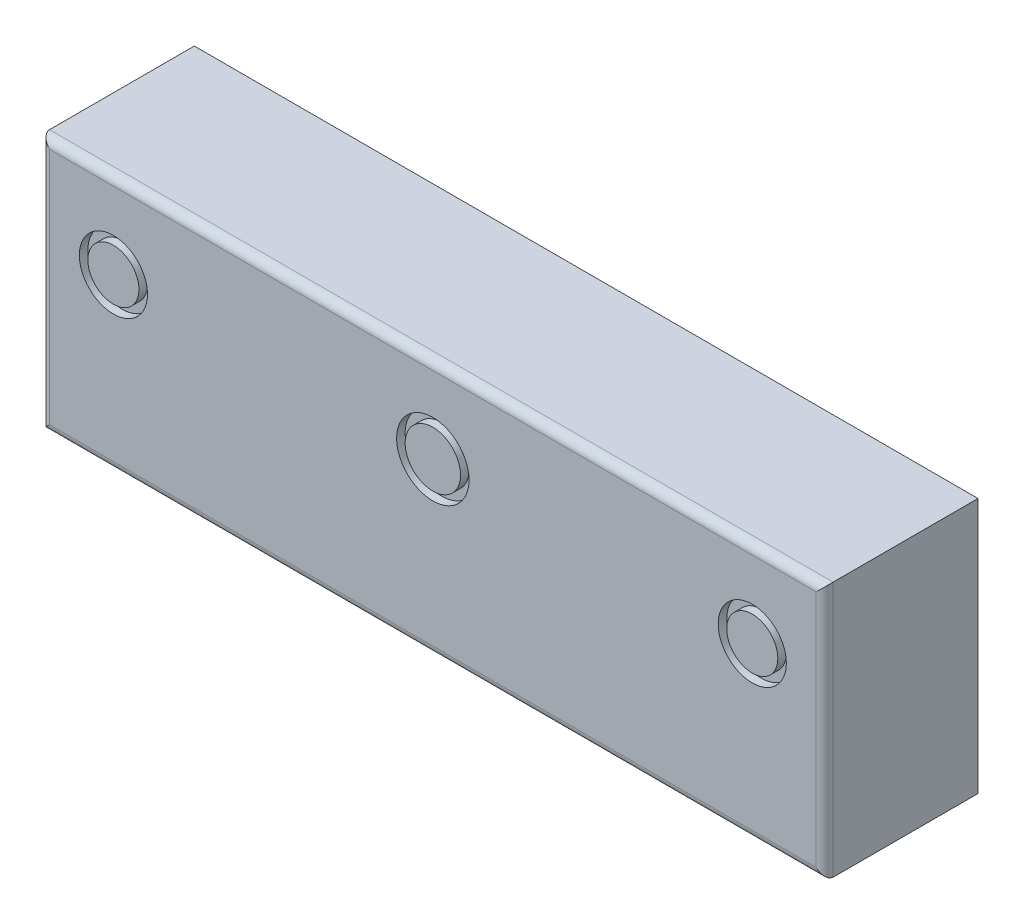
ISO-10303-21;
HEADER;
FILE_DESCRIPTION(('STEP AP214'),'2;1');
FILE_NAME('part.step','',(''),(''),'','','');
FILE_SCHEMA(('AUTOMOTIVE_DESIGN { 1 0 10303 214 1 1 1 1 }'));
ENDSEC;
DATA;
#1=APPLICATION_CONTEXT('core data for automotive mechanical design processes');
#2=APPLICATION_PROTOCOL_DEFINITION('international standard','automotive_design',2000,#1);
#3=PRODUCT_CONTEXT('',#1,'mechanical');
#4=PRODUCT('Part','Part','',(#3));
#5=PRODUCT_RELATED_PRODUCT_CATEGORY('part','',(#4));
#6=PRODUCT_DEFINITION_FORMATION('','',#4);
#7=PRODUCT_DEFINITION_CONTEXT('part definition',#1,'design');
#8=PRODUCT_DEFINITION('design','',#6,#7);
#9=PRODUCT_DEFINITION_SHAPE('','',#8);
#10=(LENGTH_UNIT() NAMED_UNIT(*) SI_UNIT(.MILLI.,.METRE.));
#11=(NAMED_UNIT(*) PLANE_ANGLE_UNIT() SI_UNIT($,.RADIAN.));
#12=(NAMED_UNIT(*) SI_UNIT($,.STERADIAN.) SOLID_ANGLE_UNIT());
#13=UNCERTAINTY_MEASURE_WITH_UNIT(LENGTH_MEASURE(1.E-05),#10,'distance_accuracy_value','');
#14=(GEOMETRIC_REPRESENTATION_CONTEXT(3) GLOBAL_UNCERTAINTY_ASSIGNED_CONTEXT((#13)) GLOBAL_UNIT_ASSIGNED_CONTEXT((#10,
#11,#12)) REPRESENTATION_CONTEXT('',''));
#15=CARTESIAN_POINT('',(0.,0.,0.));
#16=DIRECTION('',(0.,0.,1.));
#17=DIRECTION('',(1.,0.,0.));
#18=AXIS2_PLACEMENT_3D('',#15,#16,#17);
#19=CARTESIAN_POINT('',(45.9999999999999,-15.,18.));
#20=DIRECTION('',(-1.,0.,0.));
#21=DIRECTION('',(0.,0.,1.));
#22=AXIS2_PLACEMENT_3D('',#19,#20,#21);
#23=PLANE('',#22);
#24=DIRECTION('',(0.,0.,-1.));
#25=VECTOR('',#24,1.);
#26=CARTESIAN_POINT('',(45.9999999999999,15.,18.));
#27=LINE('',#26,#25);
#28=CARTESIAN_POINT('',(45.9999999999999,15.,17.));
#29=VERTEX_POINT('',#28);
#30=CARTESIAN_POINT('',(45.9999999999999,15.,0.));
#31=VERTEX_POINT('',#30);
#32=EDGE_CURVE('E98',#29,#31,#27,.T.);
#33=ORIENTED_EDGE('',*,*,#32,.F.);
#34=DIRECTION('',(0.,1.,0.));
#35=VECTOR('',#34,1.);
#36=CARTESIAN_POINT('',(45.9999999999999,-15.,17.));
#37=LINE('',#36,#35);
#38=CARTESIAN_POINT('',(45.9999999999999,-15.,17.));
#39=VERTEX_POINT('',#38);
#40=EDGE_CURVE('E56',#29,#39,#37,.F.);
#41=ORIENTED_EDGE('',*,*,#40,.T.);
#42=DIRECTION('',(0.,0.,-1.));
#43=VECTOR('',#42,1.);
#44=CARTESIAN_POINT('',(45.9999999999999,-15.,18.));
#45=LINE('',#44,#43);
#46=CARTESIAN_POINT('',(45.9999999999999,-15.,0.));
#47=VERTEX_POINT('',#46);
#48=EDGE_CURVE('E115',#39,#47,#45,.T.);
#49=ORIENTED_EDGE('',*,*,#48,.T.);
#50=DIRECTION('',(0.,1.,0.));
#51=VECTOR('',#50,1.);
#52=CARTESIAN_POINT('',(45.9999999999999,-15.,0.));
#53=LINE('',#52,#51);
#54=EDGE_CURVE('E111',#47,#31,#53,.T.);
#55=ORIENTED_EDGE('',*,*,#54,.T.);
#56=EDGE_LOOP('',(#33,#41,#49,#55));
#57=FACE_BOUND('',#56,.T.);
#58=ADVANCED_FACE('F47',(#57),#23,.F.);
#59=CARTESIAN_POINT('',(-46.0000000000001,15.,18.));
#60=DIRECTION('',(0.,-1.,0.));
#61=DIRECTION('',(0.,0.,-1.));
#62=AXIS2_PLACEMENT_3D('',#59,#60,#61);
#63=PLANE('',#62);
#64=DIRECTION('',(0.,0.,-1.));
#65=VECTOR('',#64,1.);
#66=CARTESIAN_POINT('',(-46.0000000000001,15.,18.));
#67=LINE('',#66,#65);
#68=CARTESIAN_POINT('',(-46.0000000000001,15.,17.));
#69=VERTEX_POINT('',#68);
#70=CARTESIAN_POINT('',(-46.0000000000001,15.,0.));
#71=VERTEX_POINT('',#70);
#72=EDGE_CURVE('E105',#69,#71,#67,.T.);
#73=ORIENTED_EDGE('',*,*,#72,.F.);
#74=DIRECTION('',(-1.,0.,0.));
#75=VECTOR('',#74,1.);
#76=CARTESIAN_POINT('',(-46.0000000000001,15.,17.));
#77=LINE('',#76,#75);
#78=EDGE_CURVE('E11',#69,#29,#77,.F.);
#79=ORIENTED_EDGE('',*,*,#78,.T.);
#80=ORIENTED_EDGE('',*,*,#32,.T.);
#81=DIRECTION('',(-1.,0.,0.));
#82=VECTOR('',#81,1.);
#83=CARTESIAN_POINT('',(-46.0000000000001,15.,0.));
#84=LINE('',#83,#82);
#85=EDGE_CURVE('E101',#31,#71,#84,.T.);
#86=ORIENTED_EDGE('',*,*,#85,.T.);
#87=EDGE_LOOP('',(#73,#79,#80,#86));
#88=FACE_BOUND('',#87,.T.);
#89=ADVANCED_FACE('F100',(#88),#63,.F.);
#90=CARTESIAN_POINT('',(-46.0000000000001,-15.,18.));
#91=DIRECTION('',(1.,0.,0.));
#92=DIRECTION('',(0.,0.,-1.));
#93=AXIS2_PLACEMENT_3D('',#90,#91,#92);
#94=PLANE('',#93);
#95=DIRECTION('',(0.,0.,-1.));
#96=VECTOR('',#95,1.);
#97=CARTESIAN_POINT('',(-46.0000000000001,-15.,18.));
#98=LINE('',#97,#96);
#99=CARTESIAN_POINT('',(-46.0000000000001,-15.,17.));
#100=VERTEX_POINT('',#99);
#101=CARTESIAN_POINT('',(-46.0000000000001,-15.,0.));
#102=VERTEX_POINT('',#101);
#103=EDGE_CURVE('E130',#100,#102,#98,.T.);
#104=ORIENTED_EDGE('',*,*,#103,.F.);
#105=DIRECTION('',(0.,-1.,0.));
#106=VECTOR('',#105,1.);
#107=CARTESIAN_POINT('',(-46.0000000000001,-15.,17.));
#108=LINE('',#107,#106);
#109=EDGE_CURVE('E141',#100,#69,#108,.F.);
#110=ORIENTED_EDGE('',*,*,#109,.T.);
#111=ORIENTED_EDGE('',*,*,#72,.T.);
#112=DIRECTION('',(0.,-1.,0.));
#113=VECTOR('',#112,1.);
#114=CARTESIAN_POINT('',(-46.0000000000001,-15.,0.));
#115=LINE('',#114,#113);
#116=EDGE_CURVE('E113',#71,#102,#115,.T.);
#117=ORIENTED_EDGE('',*,*,#116,.T.);
#118=EDGE_LOOP('',(#104,#110,#111,#117));
#119=FACE_BOUND('',#118,.T.);
#120=ADVANCED_FACE('F200',(#119),#94,.F.);
#121=CARTESIAN_POINT('',(-46.0000000000001,-15.,18.));
#122=DIRECTION('',(0.,1.,0.));
#123=DIRECTION('',(0.,0.,1.));
#124=AXIS2_PLACEMENT_3D('',#121,#122,#123);
#125=PLANE('',#124);
#126=ORIENTED_EDGE('',*,*,#48,.F.);
#127=DIRECTION('',(1.,0.,0.));
#128=VECTOR('',#127,1.);
#129=CARTESIAN_POINT('',(-46.0000000000001,-15.,17.));
#130=LINE('',#129,#128);
#131=EDGE_CURVE('E144',#39,#100,#130,.F.);
#132=ORIENTED_EDGE('',*,*,#131,.T.);
#133=ORIENTED_EDGE('',*,*,#103,.T.);
#134=DIRECTION('',(1.,0.,0.));
#135=VECTOR('',#134,1.);
#136=CARTESIAN_POINT('',(-46.0000000000001,-15.,0.));
#137=LINE('',#136,#135);
#138=EDGE_CURVE('E127',#102,#47,#137,.T.);
#139=ORIENTED_EDGE('',*,*,#138,.T.);
#140=EDGE_LOOP('',(#126,#132,#133,#139));
#141=FACE_BOUND('',#140,.T.);
#142=ADVANCED_FACE('F229',(#141),#125,.F.);
#143=CARTESIAN_POINT('',(0.,0.,18.));
#144=DIRECTION('',(0.,0.,-1.));
#145=DIRECTION('',(-1.,0.,0.));
#146=AXIS2_PLACEMENT_3D('',#143,#144,#145);
#147=PLANE('',#146);
#148=DIRECTION('',(-1.,0.,0.));
#149=VECTOR('',#148,1.);
#150=CARTESIAN_POINT('',(0.,14.,18.));
#151=LINE('',#150,#149);
#152=CARTESIAN_POINT('',(44.9999999999999,14.,18.));
#153=VERTEX_POINT('',#152);
#154=CARTESIAN_POINT('',(-45.0000000000001,14.,18.));
#155=VERTEX_POINT('',#154);
#156=EDGE_CURVE('E104',#153,#155,#151,.T.);
#157=ORIENTED_EDGE('',*,*,#156,.T.);
#158=DIRECTION('',(0.,-1.,0.));
#159=VECTOR('',#158,1.);
#160=CARTESIAN_POINT('',(-45.0000000000001,0.,18.));
#161=LINE('',#160,#159);
#162=CARTESIAN_POINT('',(-45.0000000000001,-14.,18.));
#163=VERTEX_POINT('',#162);
#164=EDGE_CURVE('E138',#155,#163,#161,.T.);
#165=ORIENTED_EDGE('',*,*,#164,.T.);
#166=DIRECTION('',(1.,0.,0.));
#167=VECTOR('',#166,1.);
#168=CARTESIAN_POINT('',(0.,-14.,18.));
#169=LINE('',#168,#167);
#170=CARTESIAN_POINT('',(44.9999999999999,-14.,18.));
#171=VERTEX_POINT('',#170);
#172=EDGE_CURVE('E136',#163,#171,#169,.T.);
#173=ORIENTED_EDGE('',*,*,#172,.T.);
#174=DIRECTION('',(0.,1.,0.));
#175=VECTOR('',#174,1.);
#176=CARTESIAN_POINT('',(44.9999999999999,0.,18.));
#177=LINE('',#176,#175);
#178=EDGE_CURVE('E134',#171,#153,#177,.T.);
#179=ORIENTED_EDGE('',*,*,#178,.T.);
#180=EDGE_LOOP('',(#157,#165,#173,#179));
#181=FACE_BOUND('',#180,.T.);
#182=CARTESIAN_POINT('',(-37.5,5.,18.));
#183=DIRECTION('',(0.,0.,1.));
#184=DIRECTION('',(1.,0.,0.));
#185=AXIS2_PLACEMENT_3D('',#182,#183,#184);
#186=CIRCLE('',#185,4.);
#187=CARTESIAN_POINT('',(-33.5,5.,18.));
#188=VERTEX_POINT('',#187);
#189=EDGE_CURVE('E120',#188,#188,#186,.T.);
#190=ORIENTED_EDGE('',*,*,#189,.F.);
#191=EDGE_LOOP('',(#190));
#192=FACE_BOUND('',#191,.T.);
#193=CARTESIAN_POINT('',(0.,5.,18.));
#194=DIRECTION('',(0.,0.,1.));
#195=DIRECTION('',(1.,0.,0.));
#196=AXIS2_PLACEMENT_3D('',#193,#194,#195);
#197=CIRCLE('',#196,4.25);
#198=CARTESIAN_POINT('',(4.25,5.,18.));
#199=VERTEX_POINT('',#198);
#200=EDGE_CURVE('E175',#199,#199,#197,.T.);
#201=ORIENTED_EDGE('',*,*,#200,.F.);
#202=EDGE_LOOP('',(#201));
#203=FACE_BOUND('',#202,.T.);
#204=CARTESIAN_POINT('',(37.5,5.00000000000001,18.));
#205=DIRECTION('',(0.,0.,1.));
#206=DIRECTION('',(1.,0.,0.));
#207=AXIS2_PLACEMENT_3D('',#204,#205,#206);
#208=CIRCLE('',#207,4.);
#209=CARTESIAN_POINT('',(41.5,5.00000000000001,18.));
#210=VERTEX_POINT('',#209);
#211=EDGE_CURVE('E162',#210,#210,#208,.T.);
#212=ORIENTED_EDGE('',*,*,#211,.F.);
#213=EDGE_LOOP('',(#212));
#214=FACE_BOUND('',#213,.T.);
#215=ADVANCED_FACE('F224',(#181,#192,#203,#214),#147,.F.);
#216=CARTESIAN_POINT('',(0.,0.,0.));
#217=DIRECTION('',(0.,0.,-1.));
#218=DIRECTION('',(-1.,0.,0.));
#219=AXIS2_PLACEMENT_3D('',#216,#217,#218);
#220=PLANE('',#219);
#221=ORIENTED_EDGE('',*,*,#54,.F.);
#222=ORIENTED_EDGE('',*,*,#138,.F.);
#223=ORIENTED_EDGE('',*,*,#116,.F.);
#224=ORIENTED_EDGE('',*,*,#85,.F.);
#225=EDGE_LOOP('',(#221,#222,#223,#224));
#226=FACE_BOUND('',#225,.T.);
#227=ADVANCED_FACE('F109',(#226),#220,.T.);
#228=CARTESIAN_POINT('',(37.5,5.00000000000001,17.));
#229=DIRECTION('',(0.,0.,1.));
#230=DIRECTION('',(1.,0.,0.));
#231=AXIS2_PLACEMENT_3D('',#228,#229,#230);
#232=CYLINDRICAL_SURFACE('',#231,4.);
#233=CARTESIAN_POINT('',(37.5,5.00000000000001,17.));
#234=DIRECTION('',(0.,0.,1.));
#235=DIRECTION('',(1.,0.,0.));
#236=AXIS2_PLACEMENT_3D('',#233,#234,#235);
#237=CIRCLE('',#236,4.);
#238=CARTESIAN_POINT('',(41.5,5.00000000000001,17.));
#239=VERTEX_POINT('',#238);
#240=EDGE_CURVE('E157',#239,#239,#237,.T.);
#241=ORIENTED_EDGE('',*,*,#240,.F.);
#242=EDGE_LOOP('',(#241));
#243=FACE_BOUND('',#242,.T.);
#244=ORIENTED_EDGE('',*,*,#211,.T.);
#245=EDGE_LOOP('',(#244));
#246=FACE_BOUND('',#245,.T.);
#247=ADVANCED_FACE('F185',(#243,#246),#232,.F.);
#248=CARTESIAN_POINT('',(37.5,5.00000000000001,17.));
#249=DIRECTION('',(0.,0.,1.));
#250=DIRECTION('',(1.,0.,0.));
#251=AXIS2_PLACEMENT_3D('',#248,#249,#250);
#252=PLANE('',#251);
#253=CARTESIAN_POINT('',(37.5,5.00000000000001,17.));
#254=DIRECTION('',(0.,0.,1.));
#255=DIRECTION('',(1.,0.,0.));
#256=AXIS2_PLACEMENT_3D('',#253,#254,#255);
#257=CIRCLE('',#256,3.);
#258=CARTESIAN_POINT('',(40.5,5.00000000000001,17.));
#259=VERTEX_POINT('',#258);
#260=EDGE_CURVE('E123',#259,#259,#257,.T.);
#261=ORIENTED_EDGE('',*,*,#260,.F.);
#262=EDGE_LOOP('',(#261));
#263=FACE_BOUND('',#262,.T.);
#264=ORIENTED_EDGE('',*,*,#240,.T.);
#265=EDGE_LOOP('',(#264));
#266=FACE_BOUND('',#265,.T.);
#267=ADVANCED_FACE('F183',(#263,#266),#252,.T.);
#268=CARTESIAN_POINT('',(37.5,5.00000000000001,17.));
#269=DIRECTION('',(0.,0.,1.));
#270=DIRECTION('',(1.,0.,0.));
#271=AXIS2_PLACEMENT_3D('',#268,#269,#270);
#272=CYLINDRICAL_SURFACE('',#271,3.);
#273=ORIENTED_EDGE('',*,*,#260,.T.);
#274=EDGE_LOOP('',(#273));
#275=FACE_BOUND('',#274,.T.);
#276=CARTESIAN_POINT('',(37.5,5.00000000000001,18.));
#277=DIRECTION('',(0.,0.,1.));
#278=DIRECTION('',(1.,0.,0.));
#279=AXIS2_PLACEMENT_3D('',#276,#277,#278);
#280=CIRCLE('',#279,3.);
#281=CARTESIAN_POINT('',(40.5,5.00000000000001,18.));
#282=VERTEX_POINT('',#281);
#283=EDGE_CURVE('E169',#282,#282,#280,.T.);
#284=ORIENTED_EDGE('',*,*,#283,.F.);
#285=EDGE_LOOP('',(#284));
#286=FACE_BOUND('',#285,.T.);
#287=ADVANCED_FACE('F180',(#275,#286),#272,.T.);
#288=CARTESIAN_POINT('',(0.,5.,17.));
#289=DIRECTION('',(0.,0.,1.));
#290=DIRECTION('',(1.,0.,0.));
#291=AXIS2_PLACEMENT_3D('',#288,#289,#290);
#292=CYLINDRICAL_SURFACE('',#291,4.25);
#293=CARTESIAN_POINT('',(0.,5.,17.));
#294=DIRECTION('',(0.,0.,1.));
#295=DIRECTION('',(1.,0.,0.));
#296=AXIS2_PLACEMENT_3D('',#293,#294,#295);
#297=CIRCLE('',#296,4.25);
#298=CARTESIAN_POINT('',(4.25,5.,17.));
#299=VERTEX_POINT('',#298);
#300=EDGE_CURVE('E171',#299,#299,#297,.T.);
#301=ORIENTED_EDGE('',*,*,#300,.F.);
#302=EDGE_LOOP('',(#301));
#303=FACE_BOUND('',#302,.T.);
#304=ORIENTED_EDGE('',*,*,#200,.T.);
#305=EDGE_LOOP('',(#304));
#306=FACE_BOUND('',#305,.T.);
#307=ADVANCED_FACE('F191',(#303,#306),#292,.F.);
#308=CARTESIAN_POINT('',(0.,5.,17.));
#309=DIRECTION('',(0.,0.,1.));
#310=DIRECTION('',(1.,0.,0.));
#311=AXIS2_PLACEMENT_3D('',#308,#309,#310);
#312=PLANE('',#311);
#313=CARTESIAN_POINT('',(0.,5.,17.));
#314=DIRECTION('',(0.,0.,1.));
#315=DIRECTION('',(1.,0.,0.));
#316=AXIS2_PLACEMENT_3D('',#313,#314,#315);
#317=CIRCLE('',#316,3.25);
#318=CARTESIAN_POINT('',(3.25,5.,17.));
#319=VERTEX_POINT('',#318);
#320=EDGE_CURVE('E247',#319,#319,#317,.T.);
#321=ORIENTED_EDGE('',*,*,#320,.F.);
#322=EDGE_LOOP('',(#321));
#323=FACE_BOUND('',#322,.T.);
#324=ORIENTED_EDGE('',*,*,#300,.T.);
#325=EDGE_LOOP('',(#324));
#326=FACE_BOUND('',#325,.T.);
#327=ADVANCED_FACE('F279',(#323,#326),#312,.T.);
#328=CARTESIAN_POINT('',(0.,5.,17.));
#329=DIRECTION('',(0.,0.,1.));
#330=DIRECTION('',(1.,0.,0.));
#331=AXIS2_PLACEMENT_3D('',#328,#329,#330);
#332=CYLINDRICAL_SURFACE('',#331,3.25);
#333=ORIENTED_EDGE('',*,*,#320,.T.);
#334=EDGE_LOOP('',(#333));
#335=FACE_BOUND('',#334,.T.);
#336=CARTESIAN_POINT('',(0.,5.,18.));
#337=DIRECTION('',(0.,0.,1.));
#338=DIRECTION('',(1.,0.,0.));
#339=AXIS2_PLACEMENT_3D('',#336,#337,#338);
#340=CIRCLE('',#339,3.25);
#341=CARTESIAN_POINT('',(3.25,5.,18.));
#342=VERTEX_POINT('',#341);
#343=EDGE_CURVE('E250',#342,#342,#340,.T.);
#344=ORIENTED_EDGE('',*,*,#343,.F.);
#345=EDGE_LOOP('',(#344));
#346=FACE_BOUND('',#345,.T.);
#347=ADVANCED_FACE('F269',(#335,#346),#332,.T.);
#348=CARTESIAN_POINT('',(-37.5,5.,17.));
#349=DIRECTION('',(0.,0.,1.));
#350=DIRECTION('',(1.,0.,0.));
#351=AXIS2_PLACEMENT_3D('',#348,#349,#350);
#352=CYLINDRICAL_SURFACE('',#351,4.);
#353=CARTESIAN_POINT('',(-37.5,5.,17.));
#354=DIRECTION('',(0.,0.,1.));
#355=DIRECTION('',(1.,0.,0.));
#356=AXIS2_PLACEMENT_3D('',#353,#354,#355);
#357=CIRCLE('',#356,4.);
#358=CARTESIAN_POINT('',(-33.5,5.,17.));
#359=VERTEX_POINT('',#358);
#360=EDGE_CURVE('E117',#359,#359,#357,.T.);
#361=ORIENTED_EDGE('',*,*,#360,.F.);
#362=EDGE_LOOP('',(#361));
#363=FACE_BOUND('',#362,.T.);
#364=ORIENTED_EDGE('',*,*,#189,.T.);
#365=EDGE_LOOP('',(#364));
#366=FACE_BOUND('',#365,.T.);
#367=ADVANCED_FACE('F266',(#363,#366),#352,.F.);
#368=CARTESIAN_POINT('',(-37.5,5.,17.));
#369=DIRECTION('',(0.,0.,1.));
#370=DIRECTION('',(1.,0.,0.));
#371=AXIS2_PLACEMENT_3D('',#368,#369,#370);
#372=PLANE('',#371);
#373=CARTESIAN_POINT('',(-37.5,5.,17.));
#374=DIRECTION('',(0.,0.,1.));
#375=DIRECTION('',(1.,0.,0.));
#376=AXIS2_PLACEMENT_3D('',#373,#374,#375);
#377=CIRCLE('',#376,3.);
#378=CARTESIAN_POINT('',(-34.5,5.,17.));
#379=VERTEX_POINT('',#378);
#380=EDGE_CURVE('E258',#379,#379,#377,.T.);
#381=ORIENTED_EDGE('',*,*,#380,.F.);
#382=EDGE_LOOP('',(#381));
#383=FACE_BOUND('',#382,.T.);
#384=ORIENTED_EDGE('',*,*,#360,.T.);
#385=EDGE_LOOP('',(#384));
#386=FACE_BOUND('',#385,.T.);
#387=ADVANCED_FACE('F268',(#383,#386),#372,.T.);
#388=CARTESIAN_POINT('',(-37.5,5.,17.));
#389=DIRECTION('',(0.,0.,1.));
#390=DIRECTION('',(1.,0.,0.));
#391=AXIS2_PLACEMENT_3D('',#388,#389,#390);
#392=CYLINDRICAL_SURFACE('',#391,3.);
#393=ORIENTED_EDGE('',*,*,#380,.T.);
#394=EDGE_LOOP('',(#393));
#395=FACE_BOUND('',#394,.T.);
#396=CARTESIAN_POINT('',(-37.5,5.,18.));
#397=DIRECTION('',(0.,0.,1.));
#398=DIRECTION('',(1.,0.,0.));
#399=AXIS2_PLACEMENT_3D('',#396,#397,#398);
#400=CIRCLE('',#399,3.);
#401=CARTESIAN_POINT('',(-34.5,5.,18.));
#402=VERTEX_POINT('',#401);
#403=EDGE_CURVE('E254',#402,#402,#400,.T.);
#404=ORIENTED_EDGE('',*,*,#403,.F.);
#405=EDGE_LOOP('',(#404));
#406=FACE_BOUND('',#405,.T.);
#407=ADVANCED_FACE('F276',(#395,#406),#392,.T.);
#408=ORIENTED_EDGE('',*,*,#283,.T.);
#409=EDGE_LOOP('',(#408));
#410=FACE_BOUND('',#409,.T.);
#411=ADVANCED_FACE('F237',(#410),#147,.F.);
#412=ORIENTED_EDGE('',*,*,#343,.T.);
#413=EDGE_LOOP('',(#412));
#414=FACE_BOUND('',#413,.T.);
#415=ADVANCED_FACE('F221',(#414),#147,.F.);
#416=ORIENTED_EDGE('',*,*,#403,.T.);
#417=EDGE_LOOP('',(#416));
#418=FACE_BOUND('',#417,.T.);
#419=ADVANCED_FACE('F215',(#418),#147,.F.);
#420=CARTESIAN_POINT('',(44.9999999999999,0.,17.));
#421=DIRECTION('',(0.,1.,0.));
#422=DIRECTION('',(0.,0.,1.));
#423=AXIS2_PLACEMENT_3D('',#420,#421,#422);
#424=CYLINDRICAL_SURFACE('',#423,1.);
#425=CARTESIAN_POINT('',(44.9999999999999,-14.,17.));
#426=DIRECTION('',(0.707106781186547,0.707106781186547,0.));
#427=DIRECTION('',(-0.707106781186547,0.707106781186547,0.));
#428=AXIS2_PLACEMENT_3D('',#425,#426,#427);
#429=ELLIPSE('',#428,1.41421356237309,1.);
#430=EDGE_CURVE('E150',#39,#171,#429,.F.);
#431=ORIENTED_EDGE('',*,*,#430,.F.);
#432=ORIENTED_EDGE('',*,*,#40,.F.);
#433=CARTESIAN_POINT('',(44.9999999999999,14.,17.));
#434=DIRECTION('',(-0.707106781186547,0.707106781186547,0.));
#435=DIRECTION('',(-0.707106781186547,-0.707106781186547,0.));
#436=AXIS2_PLACEMENT_3D('',#433,#434,#435);
#437=ELLIPSE('',#436,1.41421356237309,1.);
#438=EDGE_CURVE('E51',#153,#29,#437,.T.);
#439=ORIENTED_EDGE('',*,*,#438,.F.);
#440=ORIENTED_EDGE('',*,*,#178,.F.);
#441=EDGE_LOOP('',(#431,#432,#439,#440));
#442=FACE_BOUND('',#441,.T.);
#443=ADVANCED_FACE('F49',(#442),#424,.T.);
#444=CARTESIAN_POINT('',(0.,14.,17.));
#445=DIRECTION('',(-1.,0.,0.));
#446=DIRECTION('',(0.,0.,1.));
#447=AXIS2_PLACEMENT_3D('',#444,#445,#446);
#448=CYLINDRICAL_SURFACE('',#447,1.);
#449=ORIENTED_EDGE('',*,*,#438,.T.);
#450=ORIENTED_EDGE('',*,*,#78,.F.);
#451=CARTESIAN_POINT('',(-45.0000000000001,14.,17.));
#452=DIRECTION('',(-0.707106781186547,-0.707106781186547,0.));
#453=DIRECTION('',(-0.707106781186547,0.707106781186547,0.));
#454=AXIS2_PLACEMENT_3D('',#451,#452,#453);
#455=ELLIPSE('',#454,1.41421356237309,1.);
#456=EDGE_CURVE('E149',#155,#69,#455,.T.);
#457=ORIENTED_EDGE('',*,*,#456,.F.);
#458=ORIENTED_EDGE('',*,*,#156,.F.);
#459=EDGE_LOOP('',(#449,#450,#457,#458));
#460=FACE_BOUND('',#459,.T.);
#461=ADVANCED_FACE('F210',(#460),#448,.T.);
#462=CARTESIAN_POINT('',(0.,-14.,17.));
#463=DIRECTION('',(1.,0.,0.));
#464=DIRECTION('',(0.,0.,-1.));
#465=AXIS2_PLACEMENT_3D('',#462,#463,#464);
#466=CYLINDRICAL_SURFACE('',#465,1.);
#467=ORIENTED_EDGE('',*,*,#430,.T.);
#468=ORIENTED_EDGE('',*,*,#172,.F.);
#469=CARTESIAN_POINT('',(-45.0000000000001,-14.,17.));
#470=DIRECTION('',(0.707106781186547,-0.707106781186547,0.));
#471=DIRECTION('',(0.707106781186547,0.707106781186547,0.));
#472=AXIS2_PLACEMENT_3D('',#469,#470,#471);
#473=ELLIPSE('',#472,1.41421356237309,1.);
#474=EDGE_CURVE('E147',#100,#163,#473,.F.);
#475=ORIENTED_EDGE('',*,*,#474,.F.);
#476=ORIENTED_EDGE('',*,*,#131,.F.);
#477=EDGE_LOOP('',(#467,#468,#475,#476));
#478=FACE_BOUND('',#477,.T.);
#479=ADVANCED_FACE('F207',(#478),#466,.T.);
#480=CARTESIAN_POINT('',(-45.0000000000001,0.,17.));
#481=DIRECTION('',(0.,-1.,0.));
#482=DIRECTION('',(0.,0.,-1.));
#483=AXIS2_PLACEMENT_3D('',#480,#481,#482);
#484=CYLINDRICAL_SURFACE('',#483,1.);
#485=ORIENTED_EDGE('',*,*,#456,.T.);
#486=ORIENTED_EDGE('',*,*,#109,.F.);
#487=ORIENTED_EDGE('',*,*,#474,.T.);
#488=ORIENTED_EDGE('',*,*,#164,.F.);
#489=EDGE_LOOP('',(#485,#486,#487,#488));
#490=FACE_BOUND('',#489,.T.);
#491=ADVANCED_FACE('F204',(#490),#484,.T.);
#492=CLOSED_SHELL('',(#58,#89,#120,#142,#215,#227,#247,#267,#287,#307,#327,#347,#367,#387,#407,
#411,#415,#419,#443,#461,#479,#491));
#493=MANIFOLD_SOLID_BREP('B2',#492);
#494=ADVANCED_BREP_SHAPE_REPRESENTATION('',(#18,#493),#14);
#495=SHAPE_DEFINITION_REPRESENTATION(#9,#494);
ENDSEC;
END-ISO-10303-21;
